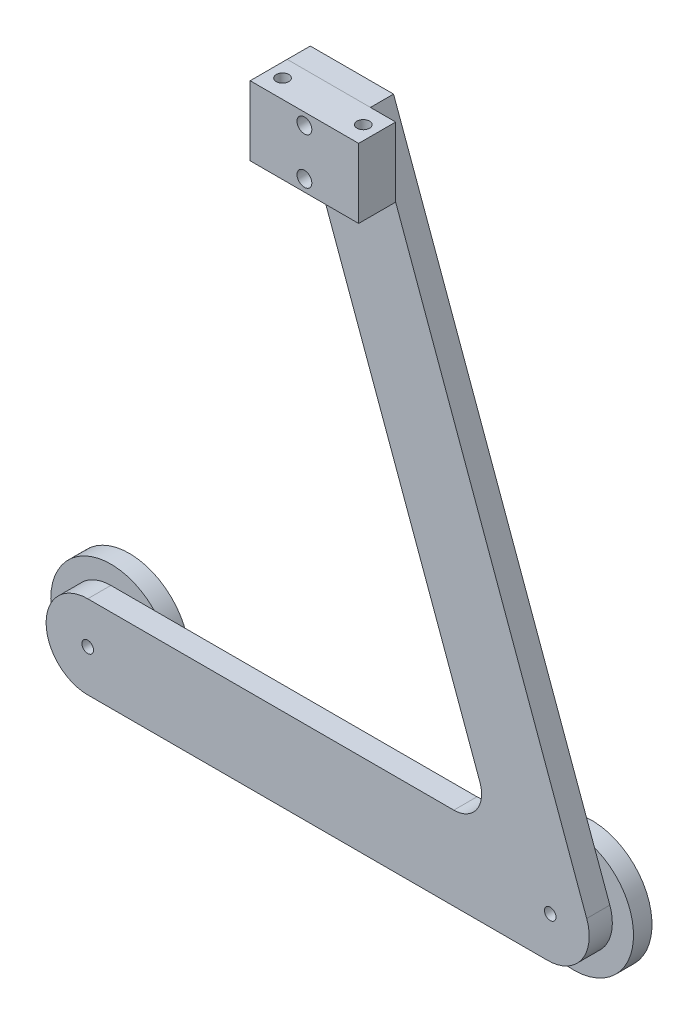
ISO-10303-21;
HEADER;
FILE_DESCRIPTION(('STEP AP214'),'2;1');
FILE_NAME('part.step','',(''),(''),'','','');
FILE_SCHEMA(('AUTOMOTIVE_DESIGN { 1 0 10303 214 1 1 1 1 }'));
ENDSEC;
DATA;
#1=APPLICATION_CONTEXT('core data for automotive mechanical design processes');
#2=APPLICATION_PROTOCOL_DEFINITION('international standard','automotive_design',2000,#1);
#3=PRODUCT_CONTEXT('',#1,'mechanical');
#4=PRODUCT('Part','Part','',(#3));
#5=PRODUCT_RELATED_PRODUCT_CATEGORY('part','',(#4));
#6=PRODUCT_DEFINITION_FORMATION('','',#4);
#7=PRODUCT_DEFINITION_CONTEXT('part definition',#1,'design');
#8=PRODUCT_DEFINITION('design','',#6,#7);
#9=PRODUCT_DEFINITION_SHAPE('','',#8);
#10=(LENGTH_UNIT() NAMED_UNIT(*) SI_UNIT(.MILLI.,.METRE.));
#11=(NAMED_UNIT(*) PLANE_ANGLE_UNIT() SI_UNIT($,.RADIAN.));
#12=(NAMED_UNIT(*) SI_UNIT($,.STERADIAN.) SOLID_ANGLE_UNIT());
#13=UNCERTAINTY_MEASURE_WITH_UNIT(LENGTH_MEASURE(1.E-05),#10,'distance_accuracy_value','');
#14=(GEOMETRIC_REPRESENTATION_CONTEXT(3) GLOBAL_UNCERTAINTY_ASSIGNED_CONTEXT((#13)) GLOBAL_UNIT_ASSIGNED_CONTEXT((#10,
#11,#12)) REPRESENTATION_CONTEXT('',''));
#15=CARTESIAN_POINT('',(0.,0.,0.));
#16=DIRECTION('',(0.,0.,1.));
#17=DIRECTION('',(1.,0.,0.));
#18=AXIS2_PLACEMENT_3D('',#15,#16,#17);
#19=CARTESIAN_POINT('',(-87.7242678916041,-8.99999999999999,-4.));
#20=DIRECTION('',(0.,0.,-1.));
#21=DIRECTION('',(-1.,0.,0.));
#22=AXIS2_PLACEMENT_3D('',#19,#20,#21);
#23=PLANE('',#22);
#24=CARTESIAN_POINT('',(-87.7242678916041,-8.99999999999999,-4.));
#25=DIRECTION('',(0.,0.,-1.));
#26=DIRECTION('',(-1.,0.,0.));
#27=AXIS2_PLACEMENT_3D('',#24,#25,#26);
#28=CIRCLE('',#27,13.);
#29=CARTESIAN_POINT('',(-100.724267891604,-8.99999999999999,-4.));
#30=VERTEX_POINT('',#29);
#31=EDGE_CURVE('E11',#30,#30,#28,.T.);
#32=ORIENTED_EDGE('',*,*,#31,.T.);
#33=EDGE_LOOP('',(#32));
#34=FACE_BOUND('',#33,.T.);
#35=CARTESIAN_POINT('',(-87.7242678916041,-8.99999999999999,-4.));
#36=DIRECTION('',(0.,0.,-1.));
#37=DIRECTION('',(-1.,0.,0.));
#38=AXIS2_PLACEMENT_3D('',#35,#36,#37);
#39=CIRCLE('',#38,3.00000000000001);
#40=CARTESIAN_POINT('',(-90.7242678916041,-8.99999999999999,-4.));
#41=VERTEX_POINT('',#40);
#42=EDGE_CURVE('E56',#41,#41,#39,.T.);
#43=ORIENTED_EDGE('',*,*,#42,.F.);
#44=EDGE_LOOP('',(#43));
#45=FACE_BOUND('',#44,.T.);
#46=ADVANCED_FACE('F45',(#34,#45),#23,.T.);
#47=CARTESIAN_POINT('',(-87.7242678916041,-8.99999999999999,0.));
#48=DIRECTION('',(0.,0.,-1.));
#49=DIRECTION('',(-1.,0.,0.));
#50=AXIS2_PLACEMENT_3D('',#47,#48,#49);
#51=PLANE('',#50);
#52=CARTESIAN_POINT('',(-87.7242678916041,-8.99999999999999,0.));
#53=DIRECTION('',(0.,0.,-1.));
#54=DIRECTION('',(-1.,0.,0.));
#55=AXIS2_PLACEMENT_3D('',#52,#53,#54);
#56=CIRCLE('',#55,13.);
#57=CARTESIAN_POINT('',(-100.724267891604,-8.99999999999999,0.));
#58=VERTEX_POINT('',#57);
#59=EDGE_CURVE('E49',#58,#58,#56,.T.);
#60=ORIENTED_EDGE('',*,*,#59,.F.);
#61=EDGE_LOOP('',(#60));
#62=FACE_BOUND('',#61,.T.);
#63=CARTESIAN_POINT('',(-87.7242678916041,-8.99999999999999,0.));
#64=DIRECTION('',(0.,0.,-1.));
#65=DIRECTION('',(-1.,0.,0.));
#66=AXIS2_PLACEMENT_3D('',#63,#64,#65);
#67=CIRCLE('',#66,3.00000000000001);
#68=CARTESIAN_POINT('',(-90.7242678916041,-8.99999999999999,0.));
#69=VERTEX_POINT('',#68);
#70=EDGE_CURVE('E58',#69,#69,#67,.T.);
#71=ORIENTED_EDGE('',*,*,#70,.T.);
#72=EDGE_LOOP('',(#71));
#73=FACE_BOUND('',#72,.T.);
#74=ADVANCED_FACE('F68',(#62,#73),#51,.F.);
#75=CARTESIAN_POINT('',(-87.7242678916041,-8.99999999999999,-4.));
#76=DIRECTION('',(0.,0.,1.));
#77=DIRECTION('',(1.,0.,0.));
#78=AXIS2_PLACEMENT_3D('',#75,#76,#77);
#79=CYLINDRICAL_SURFACE('',#78,13.);
#80=ORIENTED_EDGE('',*,*,#31,.F.);
#81=EDGE_LOOP('',(#80));
#82=FACE_BOUND('',#81,.T.);
#83=ORIENTED_EDGE('',*,*,#59,.T.);
#84=EDGE_LOOP('',(#83));
#85=FACE_BOUND('',#84,.T.);
#86=ADVANCED_FACE('F47',(#82,#85),#79,.T.);
#87=CARTESIAN_POINT('',(-87.7242678916041,-8.99999999999999,-4.));
#88=DIRECTION('',(0.,0.,1.));
#89=DIRECTION('',(1.,0.,0.));
#90=AXIS2_PLACEMENT_3D('',#87,#88,#89);
#91=CYLINDRICAL_SURFACE('',#90,3.00000000000001);
#92=ORIENTED_EDGE('',*,*,#42,.T.);
#93=EDGE_LOOP('',(#92));
#94=FACE_BOUND('',#93,.T.);
#95=ORIENTED_EDGE('',*,*,#70,.F.);
#96=EDGE_LOOP('',(#95));
#97=FACE_BOUND('',#96,.T.);
#98=ADVANCED_FACE('F64',(#94,#97),#91,.F.);
#99=CLOSED_SHELL('',(#46,#74,#86,#98));
#100=MANIFOLD_SOLID_BREP('B2',#99);
#101=CARTESIAN_POINT('',(12.2757321083959,-9.00000000000001,-4.));
#102=DIRECTION('',(0.,0.,-1.));
#103=DIRECTION('',(-1.,0.,0.));
#104=AXIS2_PLACEMENT_3D('',#101,#102,#103);
#105=PLANE('',#104);
#106=CARTESIAN_POINT('',(12.2757321083959,-9.00000000000001,-4.));
#107=DIRECTION('',(0.,0.,-1.));
#108=DIRECTION('',(-1.,0.,0.));
#109=AXIS2_PLACEMENT_3D('',#106,#107,#108);
#110=CIRCLE('',#109,13.);
#111=CARTESIAN_POINT('',(-0.724267891604135,-9.00000000000001,-4.));
#112=VERTEX_POINT('',#111);
#113=EDGE_CURVE('E44',#112,#112,#110,.T.);
#114=ORIENTED_EDGE('',*,*,#113,.T.);
#115=EDGE_LOOP('',(#114));
#116=FACE_BOUND('',#115,.T.);
#117=CARTESIAN_POINT('',(12.2757321083959,-9.00000000000001,-4.));
#118=DIRECTION('',(0.,0.,-1.));
#119=DIRECTION('',(-1.,0.,0.));
#120=AXIS2_PLACEMENT_3D('',#117,#118,#119);
#121=CIRCLE('',#120,3.);
#122=CARTESIAN_POINT('',(9.27573210839587,-9.00000000000001,-4.));
#123=VERTEX_POINT('',#122);
#124=EDGE_CURVE('E125',#123,#123,#121,.T.);
#125=ORIENTED_EDGE('',*,*,#124,.F.);
#126=EDGE_LOOP('',(#125));
#127=FACE_BOUND('',#126,.T.);
#128=ADVANCED_FACE('F114',(#116,#127),#105,.T.);
#129=CARTESIAN_POINT('',(12.2757321083959,-9.00000000000001,0.));
#130=DIRECTION('',(0.,0.,-1.));
#131=DIRECTION('',(-1.,0.,0.));
#132=AXIS2_PLACEMENT_3D('',#129,#130,#131);
#133=PLANE('',#132);
#134=CARTESIAN_POINT('',(12.2757321083959,-9.00000000000001,0.));
#135=DIRECTION('',(0.,0.,-1.));
#136=DIRECTION('',(-1.,0.,0.));
#137=AXIS2_PLACEMENT_3D('',#134,#135,#136);
#138=CIRCLE('',#137,13.);
#139=CARTESIAN_POINT('',(-0.724267891604135,-9.00000000000001,0.));
#140=VERTEX_POINT('',#139);
#141=EDGE_CURVE('E118',#140,#140,#138,.T.);
#142=ORIENTED_EDGE('',*,*,#141,.F.);
#143=EDGE_LOOP('',(#142));
#144=FACE_BOUND('',#143,.T.);
#145=CARTESIAN_POINT('',(12.2757321083959,-9.00000000000001,0.));
#146=DIRECTION('',(0.,0.,-1.));
#147=DIRECTION('',(-1.,0.,0.));
#148=AXIS2_PLACEMENT_3D('',#145,#146,#147);
#149=CIRCLE('',#148,3.);
#150=CARTESIAN_POINT('',(9.27573210839587,-9.00000000000001,0.));
#151=VERTEX_POINT('',#150);
#152=EDGE_CURVE('E127',#151,#151,#149,.T.);
#153=ORIENTED_EDGE('',*,*,#152,.T.);
#154=EDGE_LOOP('',(#153));
#155=FACE_BOUND('',#154,.T.);
#156=ADVANCED_FACE('F137',(#144,#155),#133,.F.);
#157=CARTESIAN_POINT('',(12.2757321083959,-9.00000000000001,-4.));
#158=DIRECTION('',(0.,0.,1.));
#159=DIRECTION('',(1.,0.,0.));
#160=AXIS2_PLACEMENT_3D('',#157,#158,#159);
#161=CYLINDRICAL_SURFACE('',#160,13.);
#162=ORIENTED_EDGE('',*,*,#113,.F.);
#163=EDGE_LOOP('',(#162));
#164=FACE_BOUND('',#163,.T.);
#165=ORIENTED_EDGE('',*,*,#141,.T.);
#166=EDGE_LOOP('',(#165));
#167=FACE_BOUND('',#166,.T.);
#168=ADVANCED_FACE('F116',(#164,#167),#161,.T.);
#169=CARTESIAN_POINT('',(12.2757321083959,-9.00000000000001,-4.));
#170=DIRECTION('',(0.,0.,1.));
#171=DIRECTION('',(1.,0.,0.));
#172=AXIS2_PLACEMENT_3D('',#169,#170,#171);
#173=CYLINDRICAL_SURFACE('',#172,3.);
#174=ORIENTED_EDGE('',*,*,#124,.T.);
#175=EDGE_LOOP('',(#174));
#176=FACE_BOUND('',#175,.T.);
#177=ORIENTED_EDGE('',*,*,#152,.F.);
#178=EDGE_LOOP('',(#177));
#179=FACE_BOUND('',#178,.T.);
#180=ADVANCED_FACE('F133',(#176,#179),#173,.F.);
#181=CLOSED_SHELL('',(#128,#156,#168,#180));
#182=MANIFOLD_SOLID_BREP('B6',#181);
#183=CARTESIAN_POINT('',(-87.7242678916041,-8.99999999999999,-5.));
#184=DIRECTION('',(0.,0.,-1.));
#185=DIRECTION('',(-1.,0.,0.));
#186=AXIS2_PLACEMENT_3D('',#183,#184,#185);
#187=PLANE('',#186);
#188=CARTESIAN_POINT('',(-87.7242678916041,-8.99999999999999,-5.));
#189=DIRECTION('',(0.,0.,-1.));
#190=DIRECTION('',(-1.,0.,0.));
#191=AXIS2_PLACEMENT_3D('',#188,#189,#190);
#192=CIRCLE('',#191,3.00000000000001);
#193=CARTESIAN_POINT('',(-90.7242678916041,-8.99999999999999,-5.));
#194=VERTEX_POINT('',#193);
#195=EDGE_CURVE('E113',#194,#194,#192,.T.);
#196=ORIENTED_EDGE('',*,*,#195,.T.);
#197=EDGE_LOOP('',(#196));
#198=FACE_BOUND('',#197,.T.);
#199=CARTESIAN_POINT('',(-87.7242678916041,-8.99999999999999,-5.));
#200=DIRECTION('',(0.,0.,-1.));
#201=DIRECTION('',(-1.,0.,0.));
#202=AXIS2_PLACEMENT_3D('',#199,#200,#201);
#203=CIRCLE('',#202,1.25);
#204=CARTESIAN_POINT('',(-88.9742678916041,-8.99999999999999,-5.));
#205=VERTEX_POINT('',#204);
#206=EDGE_CURVE('E194',#205,#205,#203,.T.);
#207=ORIENTED_EDGE('',*,*,#206,.F.);
#208=EDGE_LOOP('',(#207));
#209=FACE_BOUND('',#208,.T.);
#210=ADVANCED_FACE('F183',(#198,#209),#187,.T.);
#211=CARTESIAN_POINT('',(-87.7242678916041,-8.99999999999999,0.));
#212=DIRECTION('',(0.,0.,-1.));
#213=DIRECTION('',(-1.,0.,0.));
#214=AXIS2_PLACEMENT_3D('',#211,#212,#213);
#215=PLANE('',#214);
#216=CARTESIAN_POINT('',(-87.7242678916041,-8.99999999999999,0.));
#217=DIRECTION('',(0.,0.,-1.));
#218=DIRECTION('',(-1.,0.,0.));
#219=AXIS2_PLACEMENT_3D('',#216,#217,#218);
#220=CIRCLE('',#219,3.00000000000001);
#221=CARTESIAN_POINT('',(-90.7242678916041,-8.99999999999999,0.));
#222=VERTEX_POINT('',#221);
#223=EDGE_CURVE('E187',#222,#222,#220,.T.);
#224=ORIENTED_EDGE('',*,*,#223,.F.);
#225=EDGE_LOOP('',(#224));
#226=FACE_BOUND('',#225,.T.);
#227=CARTESIAN_POINT('',(-87.7242678916041,-8.99999999999999,0.));
#228=DIRECTION('',(0.,0.,-1.));
#229=DIRECTION('',(-1.,0.,0.));
#230=AXIS2_PLACEMENT_3D('',#227,#228,#229);
#231=CIRCLE('',#230,1.25);
#232=CARTESIAN_POINT('',(-88.9742678916041,-8.99999999999999,0.));
#233=VERTEX_POINT('',#232);
#234=EDGE_CURVE('E196',#233,#233,#231,.T.);
#235=ORIENTED_EDGE('',*,*,#234,.T.);
#236=EDGE_LOOP('',(#235));
#237=FACE_BOUND('',#236,.T.);
#238=ADVANCED_FACE('F206',(#226,#237),#215,.F.);
#239=CARTESIAN_POINT('',(-87.7242678916041,-8.99999999999999,-5.));
#240=DIRECTION('',(0.,0.,1.));
#241=DIRECTION('',(1.,0.,0.));
#242=AXIS2_PLACEMENT_3D('',#239,#240,#241);
#243=CYLINDRICAL_SURFACE('',#242,3.00000000000001);
#244=ORIENTED_EDGE('',*,*,#195,.F.);
#245=EDGE_LOOP('',(#244));
#246=FACE_BOUND('',#245,.T.);
#247=ORIENTED_EDGE('',*,*,#223,.T.);
#248=EDGE_LOOP('',(#247));
#249=FACE_BOUND('',#248,.T.);
#250=ADVANCED_FACE('F185',(#246,#249),#243,.T.);
#251=CARTESIAN_POINT('',(-87.7242678916041,-8.99999999999999,-5.));
#252=DIRECTION('',(0.,0.,1.));
#253=DIRECTION('',(1.,0.,0.));
#254=AXIS2_PLACEMENT_3D('',#251,#252,#253);
#255=CYLINDRICAL_SURFACE('',#254,1.25);
#256=ORIENTED_EDGE('',*,*,#206,.T.);
#257=EDGE_LOOP('',(#256));
#258=FACE_BOUND('',#257,.T.);
#259=ORIENTED_EDGE('',*,*,#234,.F.);
#260=EDGE_LOOP('',(#259));
#261=FACE_BOUND('',#260,.T.);
#262=ADVANCED_FACE('F202',(#258,#261),#255,.F.);
#263=CLOSED_SHELL('',(#210,#238,#250,#262));
#264=MANIFOLD_SOLID_BREP('B39',#263);
#265=CARTESIAN_POINT('',(12.2757321083959,-9.00000000000001,-5.));
#266=DIRECTION('',(0.,0.,-1.));
#267=DIRECTION('',(-1.,0.,0.));
#268=AXIS2_PLACEMENT_3D('',#265,#266,#267);
#269=PLANE('',#268);
#270=CARTESIAN_POINT('',(12.2757321083959,-9.00000000000001,-5.));
#271=DIRECTION('',(0.,0.,-1.));
#272=DIRECTION('',(-1.,0.,0.));
#273=AXIS2_PLACEMENT_3D('',#270,#271,#272);
#274=CIRCLE('',#273,3.);
#275=CARTESIAN_POINT('',(9.27573210839587,-9.00000000000001,-5.));
#276=VERTEX_POINT('',#275);
#277=EDGE_CURVE('E182',#276,#276,#274,.T.);
#278=ORIENTED_EDGE('',*,*,#277,.T.);
#279=EDGE_LOOP('',(#278));
#280=FACE_BOUND('',#279,.T.);
#281=CARTESIAN_POINT('',(12.2757321083959,-9.00000000000001,-5.));
#282=DIRECTION('',(0.,0.,-1.));
#283=DIRECTION('',(-1.,0.,0.));
#284=AXIS2_PLACEMENT_3D('',#281,#282,#283);
#285=CIRCLE('',#284,1.25);
#286=CARTESIAN_POINT('',(11.0257321083959,-9.00000000000001,-5.));
#287=VERTEX_POINT('',#286);
#288=EDGE_CURVE('E265',#287,#287,#285,.T.);
#289=ORIENTED_EDGE('',*,*,#288,.F.);
#290=EDGE_LOOP('',(#289));
#291=FACE_BOUND('',#290,.T.);
#292=ADVANCED_FACE('F254',(#280,#291),#269,.T.);
#293=CARTESIAN_POINT('',(12.2757321083959,-9.00000000000001,0.));
#294=DIRECTION('',(0.,0.,-1.));
#295=DIRECTION('',(-1.,0.,0.));
#296=AXIS2_PLACEMENT_3D('',#293,#294,#295);
#297=PLANE('',#296);
#298=CARTESIAN_POINT('',(12.2757321083959,-9.00000000000001,0.));
#299=DIRECTION('',(0.,0.,-1.));
#300=DIRECTION('',(-1.,0.,0.));
#301=AXIS2_PLACEMENT_3D('',#298,#299,#300);
#302=CIRCLE('',#301,3.);
#303=CARTESIAN_POINT('',(9.27573210839587,-9.00000000000001,0.));
#304=VERTEX_POINT('',#303);
#305=EDGE_CURVE('E258',#304,#304,#302,.T.);
#306=ORIENTED_EDGE('',*,*,#305,.F.);
#307=EDGE_LOOP('',(#306));
#308=FACE_BOUND('',#307,.T.);
#309=CARTESIAN_POINT('',(12.2757321083959,-9.00000000000001,0.));
#310=DIRECTION('',(0.,0.,-1.));
#311=DIRECTION('',(-1.,0.,0.));
#312=AXIS2_PLACEMENT_3D('',#309,#310,#311);
#313=CIRCLE('',#312,1.25);
#314=CARTESIAN_POINT('',(11.0257321083959,-9.00000000000001,0.));
#315=VERTEX_POINT('',#314);
#316=EDGE_CURVE('E267',#315,#315,#313,.T.);
#317=ORIENTED_EDGE('',*,*,#316,.T.);
#318=EDGE_LOOP('',(#317));
#319=FACE_BOUND('',#318,.T.);
#320=ADVANCED_FACE('F277',(#308,#319),#297,.F.);
#321=CARTESIAN_POINT('',(12.2757321083959,-9.00000000000001,-5.));
#322=DIRECTION('',(0.,0.,1.));
#323=DIRECTION('',(1.,0.,0.));
#324=AXIS2_PLACEMENT_3D('',#321,#322,#323);
#325=CYLINDRICAL_SURFACE('',#324,3.);
#326=ORIENTED_EDGE('',*,*,#277,.F.);
#327=EDGE_LOOP('',(#326));
#328=FACE_BOUND('',#327,.T.);
#329=ORIENTED_EDGE('',*,*,#305,.T.);
#330=EDGE_LOOP('',(#329));
#331=FACE_BOUND('',#330,.T.);
#332=ADVANCED_FACE('F256',(#328,#331),#325,.T.);
#333=CARTESIAN_POINT('',(12.2757321083959,-9.00000000000001,-5.));
#334=DIRECTION('',(0.,0.,1.));
#335=DIRECTION('',(1.,0.,0.));
#336=AXIS2_PLACEMENT_3D('',#333,#334,#335);
#337=CYLINDRICAL_SURFACE('',#336,1.25);
#338=ORIENTED_EDGE('',*,*,#288,.T.);
#339=EDGE_LOOP('',(#338));
#340=FACE_BOUND('',#339,.T.);
#341=ORIENTED_EDGE('',*,*,#316,.F.);
#342=EDGE_LOOP('',(#341));
#343=FACE_BOUND('',#342,.T.);
#344=ADVANCED_FACE('F273',(#340,#343),#337,.F.);
#345=CLOSED_SHELL('',(#292,#320,#332,#344));
#346=MANIFOLD_SOLID_BREP('B108',#345);
#347=CARTESIAN_POINT('',(-44.6070879571983,122.556966910027,13.));
#348=DIRECTION('',(1.,0.,0.));
#349=DIRECTION('',(0.,0.,-1.));
#350=AXIS2_PLACEMENT_3D('',#347,#348,#349);
#351=PLANE('',#350);
#352=DIRECTION('',(0.,-1.,0.));
#353=VECTOR('',#352,1.);
#354=CARTESIAN_POINT('',(-44.6070879571983,122.556966910027,5.));
#355=LINE('',#354,#353);
#356=CARTESIAN_POINT('',(-44.6070879571983,122.556966910027,5.));
#357=VERTEX_POINT('',#356);
#358=CARTESIAN_POINT('',(-44.6070879571983,107.556966910027,5.));
#359=VERTEX_POINT('',#358);
#360=EDGE_CURVE('E391',#357,#359,#355,.T.);
#361=ORIENTED_EDGE('',*,*,#360,.T.);
#362=DIRECTION('',(0.,0.,-1.));
#363=VECTOR('',#362,1.);
#364=CARTESIAN_POINT('',(-44.6070879571983,107.556966910027,13.));
#365=LINE('',#364,#363);
#366=CARTESIAN_POINT('',(-44.6070879571983,107.556966910027,13.));
#367=VERTEX_POINT('',#366);
#368=EDGE_CURVE('E252',#367,#359,#365,.T.);
#369=ORIENTED_EDGE('',*,*,#368,.F.);
#370=DIRECTION('',(0.,-1.,0.));
#371=VECTOR('',#370,1.);
#372=CARTESIAN_POINT('',(-44.6070879571983,122.556966910027,13.));
#373=LINE('',#372,#371);
#374=CARTESIAN_POINT('',(-44.6070879571983,122.556966910027,13.));
#375=VERTEX_POINT('',#374);
#376=EDGE_CURVE('E378',#375,#367,#373,.T.);
#377=ORIENTED_EDGE('',*,*,#376,.F.);
#378=DIRECTION('',(0.,0.,-1.));
#379=VECTOR('',#378,1.);
#380=CARTESIAN_POINT('',(-44.6070879571983,122.556966910027,13.));
#381=LINE('',#380,#379);
#382=EDGE_CURVE('E387',#375,#357,#381,.T.);
#383=ORIENTED_EDGE('',*,*,#382,.T.);
#384=EDGE_LOOP('',(#361,#369,#377,#383));
#385=FACE_BOUND('',#384,.T.);
#386=ADVANCED_FACE('F325',(#385),#351,.F.);
#387=CARTESIAN_POINT('',(-44.6070879571983,107.556966910027,13.));
#388=DIRECTION('',(0.,1.,0.));
#389=DIRECTION('',(0.,0.,1.));
#390=AXIS2_PLACEMENT_3D('',#387,#388,#389);
#391=PLANE('',#390);
#392=CARTESIAN_POINT('',(-24.1475344432052,107.556966910027,9.));
#393=DIRECTION('',(0.,-1.,0.));
#394=DIRECTION('',(0.,0.,-1.));
#395=AXIS2_PLACEMENT_3D('',#392,#393,#394);
#396=CIRCLE('',#395,1.35);
#397=CARTESIAN_POINT('',(-24.1475344432052,107.556966910027,7.65));
#398=VERTEX_POINT('',#397);
#399=EDGE_CURVE('E419',#398,#398,#396,.T.);
#400=ORIENTED_EDGE('',*,*,#399,.F.);
#401=EDGE_LOOP('',(#400));
#402=FACE_BOUND('',#401,.T.);
#403=CARTESIAN_POINT('',(-41.6070879571983,107.556966910027,9.));
#404=DIRECTION('',(0.,-1.,0.));
#405=DIRECTION('',(0.,0.,1.));
#406=AXIS2_PLACEMENT_3D('',#403,#404,#405);
#407=CIRCLE('',#406,1.35);
#408=CARTESIAN_POINT('',(-41.6070879571983,107.556966910027,10.35));
#409=VERTEX_POINT('',#408);
#410=EDGE_CURVE('E413',#409,#409,#407,.T.);
#411=ORIENTED_EDGE('',*,*,#410,.F.);
#412=EDGE_LOOP('',(#411));
#413=FACE_BOUND('',#412,.T.);
#414=DIRECTION('',(1.,0.,0.));
#415=VECTOR('',#414,1.);
#416=CARTESIAN_POINT('',(-44.6070879571983,107.556966910027,5.));
#417=LINE('',#416,#415);
#418=CARTESIAN_POINT('',(-21.1475344432052,107.556966910027,5.));
#419=VERTEX_POINT('',#418);
#420=EDGE_CURVE('E382',#359,#419,#417,.T.);
#421=ORIENTED_EDGE('',*,*,#420,.T.);
#422=DIRECTION('',(0.,0.,-1.));
#423=VECTOR('',#422,1.);
#424=CARTESIAN_POINT('',(-21.1475344432052,107.556966910027,13.));
#425=LINE('',#424,#423);
#426=CARTESIAN_POINT('',(-21.1475344432052,107.556966910027,13.));
#427=VERTEX_POINT('',#426);
#428=EDGE_CURVE('E334',#427,#419,#425,.T.);
#429=ORIENTED_EDGE('',*,*,#428,.F.);
#430=DIRECTION('',(1.,0.,0.));
#431=VECTOR('',#430,1.);
#432=CARTESIAN_POINT('',(-44.6070879571983,107.556966910027,13.));
#433=LINE('',#432,#431);
#434=EDGE_CURVE('E373',#367,#427,#433,.T.);
#435=ORIENTED_EDGE('',*,*,#434,.F.);
#436=ORIENTED_EDGE('',*,*,#368,.T.);
#437=EDGE_LOOP('',(#421,#429,#435,#436));
#438=FACE_BOUND('',#437,.T.);
#439=ADVANCED_FACE('F381',(#402,#413,#438),#391,.F.);
#440=CARTESIAN_POINT('',(-21.1475344432052,122.556966910027,13.));
#441=DIRECTION('',(-1.,0.,0.));
#442=DIRECTION('',(0.,0.,1.));
#443=AXIS2_PLACEMENT_3D('',#440,#441,#442);
#444=PLANE('',#443);
#445=DIRECTION('',(0.,1.,0.));
#446=VECTOR('',#445,1.);
#447=CARTESIAN_POINT('',(-21.1475344432052,122.556966910027,5.));
#448=LINE('',#447,#446);
#449=CARTESIAN_POINT('',(-21.1475344432052,122.556966910027,5.));
#450=VERTEX_POINT('',#449);
#451=EDGE_CURVE('E360',#419,#450,#448,.T.);
#452=ORIENTED_EDGE('',*,*,#451,.T.);
#453=DIRECTION('',(0.,0.,-1.));
#454=VECTOR('',#453,1.);
#455=CARTESIAN_POINT('',(-21.1475344432052,122.556966910027,13.));
#456=LINE('',#455,#454);
#457=CARTESIAN_POINT('',(-21.1475344432052,122.556966910027,13.));
#458=VERTEX_POINT('',#457);
#459=EDGE_CURVE('E383',#458,#450,#456,.T.);
#460=ORIENTED_EDGE('',*,*,#459,.F.);
#461=DIRECTION('',(0.,1.,0.));
#462=VECTOR('',#461,1.);
#463=CARTESIAN_POINT('',(-21.1475344432052,122.556966910027,13.));
#464=LINE('',#463,#462);
#465=EDGE_CURVE('E376',#427,#458,#464,.T.);
#466=ORIENTED_EDGE('',*,*,#465,.F.);
#467=ORIENTED_EDGE('',*,*,#428,.T.);
#468=EDGE_LOOP('',(#452,#460,#466,#467));
#469=FACE_BOUND('',#468,.T.);
#470=ADVANCED_FACE('F385',(#469),#444,.F.);
#471=CARTESIAN_POINT('',(-44.6070879571983,122.556966910027,13.));
#472=DIRECTION('',(0.,-1.,0.));
#473=DIRECTION('',(0.,0.,-1.));
#474=AXIS2_PLACEMENT_3D('',#471,#472,#473);
#475=PLANE('',#474);
#476=CARTESIAN_POINT('',(-24.1475344432052,122.556966910027,9.));
#477=DIRECTION('',(0.,-1.,0.));
#478=DIRECTION('',(0.,0.,-1.));
#479=AXIS2_PLACEMENT_3D('',#476,#477,#478);
#480=CIRCLE('',#479,1.35);
#481=CARTESIAN_POINT('',(-24.1475344432052,122.556966910027,7.65));
#482=VERTEX_POINT('',#481);
#483=EDGE_CURVE('E410',#482,#482,#480,.T.);
#484=ORIENTED_EDGE('',*,*,#483,.T.);
#485=EDGE_LOOP('',(#484));
#486=FACE_BOUND('',#485,.T.);
#487=CARTESIAN_POINT('',(-41.6070879571983,122.556966910027,9.));
#488=DIRECTION('',(0.,-1.,0.));
#489=DIRECTION('',(0.,0.,1.));
#490=AXIS2_PLACEMENT_3D('',#487,#488,#489);
#491=CIRCLE('',#490,1.35);
#492=CARTESIAN_POINT('',(-41.6070879571983,122.556966910027,10.35));
#493=VERTEX_POINT('',#492);
#494=EDGE_CURVE('E416',#493,#493,#491,.T.);
#495=ORIENTED_EDGE('',*,*,#494,.T.);
#496=EDGE_LOOP('',(#495));
#497=FACE_BOUND('',#496,.T.);
#498=DIRECTION('',(-1.,0.,0.));
#499=VECTOR('',#498,1.);
#500=CARTESIAN_POINT('',(-44.6070879571983,122.556966910027,5.));
#501=LINE('',#500,#499);
#502=EDGE_CURVE('E366',#450,#357,#501,.T.);
#503=ORIENTED_EDGE('',*,*,#502,.T.);
#504=ORIENTED_EDGE('',*,*,#382,.F.);
#505=DIRECTION('',(-1.,0.,0.));
#506=VECTOR('',#505,1.);
#507=CARTESIAN_POINT('',(-44.6070879571983,122.556966910027,13.));
#508=LINE('',#507,#506);
#509=EDGE_CURVE('E343',#458,#375,#508,.T.);
#510=ORIENTED_EDGE('',*,*,#509,.F.);
#511=ORIENTED_EDGE('',*,*,#459,.T.);
#512=EDGE_LOOP('',(#503,#504,#510,#511));
#513=FACE_BOUND('',#512,.T.);
#514=ADVANCED_FACE('F425',(#486,#497,#513),#475,.F.);
#515=CARTESIAN_POINT('',(0.,0.,13.));
#516=DIRECTION('',(0.,0.,1.));
#517=DIRECTION('',(1.,0.,0.));
#518=AXIS2_PLACEMENT_3D('',#515,#516,#517);
#519=PLANE('',#518);
#520=CARTESIAN_POINT('',(-32.8773112002017,120.056966910027,13.));
#521=DIRECTION('',(0.,0.,1.));
#522=DIRECTION('',(1.,0.,0.));
#523=AXIS2_PLACEMENT_3D('',#520,#521,#522);
#524=CIRCLE('',#523,1.60000000000001);
#525=CARTESIAN_POINT('',(-31.2773112002017,120.056966910027,13.));
#526=VERTEX_POINT('',#525);
#527=EDGE_CURVE('E400',#526,#526,#524,.T.);
#528=ORIENTED_EDGE('',*,*,#527,.F.);
#529=EDGE_LOOP('',(#528));
#530=FACE_BOUND('',#529,.T.);
#531=CARTESIAN_POINT('',(-32.8773112002017,110.056966910027,13.));
#532=DIRECTION('',(0.,0.,1.));
#533=DIRECTION('',(-1.,0.,0.));
#534=AXIS2_PLACEMENT_3D('',#531,#532,#533);
#535=CIRCLE('',#534,1.60000000000001);
#536=CARTESIAN_POINT('',(-34.4773112002017,110.056966910027,13.));
#537=VERTEX_POINT('',#536);
#538=EDGE_CURVE('E405',#537,#537,#535,.T.);
#539=ORIENTED_EDGE('',*,*,#538,.F.);
#540=EDGE_LOOP('',(#539));
#541=FACE_BOUND('',#540,.T.);
#542=ORIENTED_EDGE('',*,*,#376,.T.);
#543=ORIENTED_EDGE('',*,*,#434,.T.);
#544=ORIENTED_EDGE('',*,*,#465,.T.);
#545=ORIENTED_EDGE('',*,*,#509,.T.);
#546=EDGE_LOOP('',(#542,#543,#544,#545));
#547=FACE_BOUND('',#546,.T.);
#548=ADVANCED_FACE('F374',(#530,#541,#547),#519,.T.);
#549=CARTESIAN_POINT('',(0.,0.,5.));
#550=DIRECTION('',(0.,0.,1.));
#551=DIRECTION('',(1.,0.,0.));
#552=AXIS2_PLACEMENT_3D('',#549,#550,#551);
#553=PLANE('',#552);
#554=CARTESIAN_POINT('',(-32.8773112002017,120.056966910027,5.));
#555=DIRECTION('',(0.,0.,1.));
#556=DIRECTION('',(1.,0.,0.));
#557=AXIS2_PLACEMENT_3D('',#554,#555,#556);
#558=CIRCLE('',#557,1.60000000000001);
#559=CARTESIAN_POINT('',(-31.2773112002017,120.056966910027,5.));
#560=VERTEX_POINT('',#559);
#561=EDGE_CURVE('E328',#560,#560,#558,.T.);
#562=ORIENTED_EDGE('',*,*,#561,.T.);
#563=EDGE_LOOP('',(#562));
#564=FACE_BOUND('',#563,.T.);
#565=CARTESIAN_POINT('',(-32.8773112002017,110.056966910027,5.));
#566=DIRECTION('',(0.,0.,1.));
#567=DIRECTION('',(1.,0.,0.));
#568=AXIS2_PLACEMENT_3D('',#565,#566,#567);
#569=CIRCLE('',#568,1.60000000000001);
#570=CARTESIAN_POINT('',(-31.2773112002017,110.056966910027,5.));
#571=VERTEX_POINT('',#570);
#572=EDGE_CURVE('E398',#571,#571,#569,.T.);
#573=ORIENTED_EDGE('',*,*,#572,.T.);
#574=EDGE_LOOP('',(#573));
#575=FACE_BOUND('',#574,.T.);
#576=ORIENTED_EDGE('',*,*,#360,.F.);
#577=ORIENTED_EDGE('',*,*,#502,.F.);
#578=ORIENTED_EDGE('',*,*,#451,.F.);
#579=ORIENTED_EDGE('',*,*,#420,.F.);
#580=EDGE_LOOP('',(#576,#577,#578,#579));
#581=FACE_BOUND('',#580,.T.);
#582=ADVANCED_FACE('F455',(#564,#575,#581),#553,.F.);
#583=CARTESIAN_POINT('',(-32.8773112002017,110.056966910027,0.));
#584=DIRECTION('',(0.,0.,1.));
#585=DIRECTION('',(1.,0.,0.));
#586=AXIS2_PLACEMENT_3D('',#583,#584,#585);
#587=CYLINDRICAL_SURFACE('',#586,1.60000000000001);
#588=ORIENTED_EDGE('',*,*,#538,.T.);
#589=EDGE_LOOP('',(#588));
#590=FACE_BOUND('',#589,.T.);
#591=ORIENTED_EDGE('',*,*,#572,.F.);
#592=EDGE_LOOP('',(#591));
#593=FACE_BOUND('',#592,.T.);
#594=ADVANCED_FACE('F446',(#590,#593),#587,.F.);
#595=CARTESIAN_POINT('',(-32.8773112002017,120.056966910027,0.));
#596=DIRECTION('',(0.,0.,1.));
#597=DIRECTION('',(1.,0.,0.));
#598=AXIS2_PLACEMENT_3D('',#595,#596,#597);
#599=CYLINDRICAL_SURFACE('',#598,1.60000000000001);
#600=ORIENTED_EDGE('',*,*,#527,.T.);
#601=EDGE_LOOP('',(#600));
#602=FACE_BOUND('',#601,.T.);
#603=ORIENTED_EDGE('',*,*,#561,.F.);
#604=EDGE_LOOP('',(#603));
#605=FACE_BOUND('',#604,.T.);
#606=ADVANCED_FACE('F440',(#602,#605),#599,.F.);
#607=CARTESIAN_POINT('',(-41.6070879571983,122.556966910027,9.));
#608=DIRECTION('',(0.,-1.,0.));
#609=DIRECTION('',(0.,0.,-1.));
#610=AXIS2_PLACEMENT_3D('',#607,#608,#609);
#611=CYLINDRICAL_SURFACE('',#610,1.35);
#612=ORIENTED_EDGE('',*,*,#494,.F.);
#613=EDGE_LOOP('',(#612));
#614=FACE_BOUND('',#613,.T.);
#615=ORIENTED_EDGE('',*,*,#410,.T.);
#616=EDGE_LOOP('',(#615));
#617=FACE_BOUND('',#616,.T.);
#618=ADVANCED_FACE('F431',(#614,#617),#611,.F.);
#619=CARTESIAN_POINT('',(-24.1475344432052,122.556966910027,9.));
#620=DIRECTION('',(0.,-1.,0.));
#621=DIRECTION('',(0.,0.,-1.));
#622=AXIS2_PLACEMENT_3D('',#619,#620,#621);
#623=CYLINDRICAL_SURFACE('',#622,1.35);
#624=ORIENTED_EDGE('',*,*,#483,.F.);
#625=EDGE_LOOP('',(#624));
#626=FACE_BOUND('',#625,.T.);
#627=ORIENTED_EDGE('',*,*,#399,.T.);
#628=EDGE_LOOP('',(#627));
#629=FACE_BOUND('',#628,.T.);
#630=ADVANCED_FACE('F428',(#626,#629),#623,.F.);
#631=CLOSED_SHELL('',(#386,#439,#470,#514,#548,#582,#594,#606,#618,#630));
#632=MANIFOLD_SOLID_BREP('B177',#631);
#633=CARTESIAN_POINT('',(-8.56888804045274,6.00000000000001,5.));
#634=DIRECTION('',(0.,0.,-1.));
#635=DIRECTION('',(-1.,0.,0.));
#636=AXIS2_PLACEMENT_3D('',#633,#634,#635);
#637=PLANE('',#636);
#638=CARTESIAN_POINT('',(-32.8773112002017,120.056966910027,5.));
#639=DIRECTION('',(0.,0.,-1.));
#640=DIRECTION('',(-1.,0.,0.));
#641=AXIS2_PLACEMENT_3D('',#638,#639,#640);
#642=CIRCLE('',#641,1.60000000000001);
#643=CARTESIAN_POINT('',(-34.4773112002017,120.056966910027,5.));
#644=VERTEX_POINT('',#643);
#645=EDGE_CURVE('E687',#644,#644,#642,.T.);
#646=ORIENTED_EDGE('',*,*,#645,.T.);
#647=EDGE_LOOP('',(#646));
#648=FACE_BOUND('',#647,.T.);
#649=CARTESIAN_POINT('',(-32.8773112002017,110.056966910027,5.));
#650=DIRECTION('',(0.,0.,-1.));
#651=DIRECTION('',(-1.,0.,0.));
#652=AXIS2_PLACEMENT_3D('',#649,#650,#651);
#653=CIRCLE('',#652,1.60000000000001);
#654=CARTESIAN_POINT('',(-34.4773112002017,110.056966910027,5.));
#655=VERTEX_POINT('',#654);
#656=EDGE_CURVE('E692',#655,#655,#653,.T.);
#657=ORIENTED_EDGE('',*,*,#656,.T.);
#658=EDGE_LOOP('',(#657));
#659=FACE_BOUND('',#658,.T.);
#660=DIRECTION('',(-1.,0.,0.));
#661=VECTOR('',#660,1.);
#662=CARTESIAN_POINT('',(-26.6070879571983,122.556966910027,5.));
#663=LINE('',#662,#661);
#664=CARTESIAN_POINT('',(-26.6070879571983,122.556966910027,5.));
#665=VERTEX_POINT('',#664);
#666=CARTESIAN_POINT('',(-44.6070879571983,122.556966910027,5.));
#667=VERTEX_POINT('',#666);
#668=EDGE_CURVE('E645',#665,#667,#663,.T.);
#669=ORIENTED_EDGE('',*,*,#668,.T.);
#670=DIRECTION('',(0.342020143325672,-0.939692620785907,0.));
#671=VECTOR('',#670,1.);
#672=CARTESIAN_POINT('',(-44.6070879571983,122.556966910027,5.));
#673=LINE('',#672,#671);
#674=CARTESIAN_POINT('',(-2.93073231573729,8.05212085995404,5.));
#675=VERTEX_POINT('',#674);
#676=EDGE_CURVE('E592',#667,#675,#673,.T.);
#677=ORIENTED_EDGE('',*,*,#676,.T.);
#678=CARTESIAN_POINT('',(-8.56888804045274,6.00000000000001,5.));
#679=DIRECTION('',(0.,0.,-1.));
#680=DIRECTION('',(-1.,0.,0.));
#681=AXIS2_PLACEMENT_3D('',#678,#679,#680);
#682=CIRCLE('',#681,6.00000000000001);
#683=CARTESIAN_POINT('',(-8.56888804045273,0.,5.));
#684=VERTEX_POINT('',#683);
#685=EDGE_CURVE('E660',#675,#684,#682,.T.);
#686=ORIENTED_EDGE('',*,*,#685,.T.);
#687=DIRECTION('',(-1.,0.,0.));
#688=VECTOR('',#687,1.);
#689=CARTESIAN_POINT('',(-8.56888804045274,0.,5.));
#690=LINE('',#689,#688);
#691=CARTESIAN_POINT('',(-87.7242678916041,0.,5.));
#692=VERTEX_POINT('',#691);
#693=EDGE_CURVE('E672',#684,#692,#690,.T.);
#694=ORIENTED_EDGE('',*,*,#693,.T.);
#695=CARTESIAN_POINT('',(-87.7242678916041,-8.99999999999999,5.));
#696=DIRECTION('',(0.,0.,1.));
#697=DIRECTION('',(1.,0.,0.));
#698=AXIS2_PLACEMENT_3D('',#695,#696,#697);
#699=CIRCLE('',#698,9.);
#700=CARTESIAN_POINT('',(-87.7242678916041,-18.,5.));
#701=VERTEX_POINT('',#700);
#702=EDGE_CURVE('E611',#692,#701,#699,.T.);
#703=ORIENTED_EDGE('',*,*,#702,.T.);
#704=DIRECTION('',(1.,0.,0.));
#705=VECTOR('',#704,1.);
#706=CARTESIAN_POINT('',(-87.7242678916041,-18.,5.));
#707=LINE('',#706,#705);
#708=CARTESIAN_POINT('',(11.6981321561127,-18.,5.));
#709=VERTEX_POINT('',#708);
#710=EDGE_CURVE('E605',#701,#709,#707,.T.);
#711=ORIENTED_EDGE('',*,*,#710,.T.);
#712=CARTESIAN_POINT('',(11.6981321561127,-9.00000000000001,5.));
#713=DIRECTION('',(0.,0.,1.));
#714=DIRECTION('',(1.,0.,0.));
#715=AXIS2_PLACEMENT_3D('',#712,#713,#714);
#716=CIRCLE('',#715,8.99999999999999);
#717=CARTESIAN_POINT('',(20.1553657431858,-5.92181871006896,5.));
#718=VERTEX_POINT('',#717);
#719=EDGE_CURVE('E609',#709,#718,#716,.T.);
#720=ORIENTED_EDGE('',*,*,#719,.T.);
#721=DIRECTION('',(-0.342020143325672,0.939692620785907,0.));
#722=VECTOR('',#721,1.);
#723=CARTESIAN_POINT('',(20.1553657431858,-5.92181871006897,5.));
#724=LINE('',#723,#722);
#725=EDGE_CURVE('E549',#718,#665,#724,.T.);
#726=ORIENTED_EDGE('',*,*,#725,.T.);
#727=EDGE_LOOP('',(#669,#677,#686,#694,#703,#711,#720,#726));
#728=FACE_BOUND('',#727,.T.);
#729=CARTESIAN_POINT('',(-87.7242678916041,-8.99999999999999,5.));
#730=DIRECTION('',(0.,0.,1.));
#731=DIRECTION('',(1.,0.,0.));
#732=AXIS2_PLACEMENT_3D('',#729,#730,#731);
#733=CIRCLE('',#732,1.25);
#734=CARTESIAN_POINT('',(-86.4742678916041,-8.99999999999999,5.));
#735=VERTEX_POINT('',#734);
#736=EDGE_CURVE('E633',#735,#735,#733,.T.);
#737=ORIENTED_EDGE('',*,*,#736,.F.);
#738=EDGE_LOOP('',(#737));
#739=FACE_BOUND('',#738,.T.);
#740=CARTESIAN_POINT('',(12.2757321083959,-9.00000000000001,5.));
#741=DIRECTION('',(0.,0.,1.));
#742=DIRECTION('',(1.,0.,0.));
#743=AXIS2_PLACEMENT_3D('',#740,#741,#742);
#744=CIRCLE('',#743,1.25);
#745=CARTESIAN_POINT('',(13.5257321083959,-9.00000000000001,5.));
#746=VERTEX_POINT('',#745);
#747=EDGE_CURVE('E681',#746,#746,#744,.T.);
#748=ORIENTED_EDGE('',*,*,#747,.F.);
#749=EDGE_LOOP('',(#748));
#750=FACE_BOUND('',#749,.T.);
#751=ADVANCED_FACE('F532',(#648,#659,#728,#739,#750),#637,.F.);
#752=CARTESIAN_POINT('',(-8.56888804045274,6.00000000000001,0.));
#753=DIRECTION('',(0.,0.,-1.));
#754=DIRECTION('',(-1.,0.,0.));
#755=AXIS2_PLACEMENT_3D('',#752,#753,#754);
#756=PLANE('',#755);
#757=CARTESIAN_POINT('',(-32.8773112002017,120.056966910027,0.));
#758=DIRECTION('',(0.,0.,1.));
#759=DIRECTION('',(1.,0.,0.));
#760=AXIS2_PLACEMENT_3D('',#757,#758,#759);
#761=CIRCLE('',#760,1.60000000000001);
#762=CARTESIAN_POINT('',(-31.2773112002017,120.056966910027,0.));
#763=VERTEX_POINT('',#762);
#764=EDGE_CURVE('E695',#763,#763,#761,.T.);
#765=ORIENTED_EDGE('',*,*,#764,.T.);
#766=EDGE_LOOP('',(#765));
#767=FACE_BOUND('',#766,.T.);
#768=CARTESIAN_POINT('',(-32.8773112002017,110.056966910027,0.));
#769=DIRECTION('',(0.,0.,1.));
#770=DIRECTION('',(-1.,0.,0.));
#771=AXIS2_PLACEMENT_3D('',#768,#769,#770);
#772=CIRCLE('',#771,1.60000000000001);
#773=CARTESIAN_POINT('',(-34.4773112002017,110.056966910027,0.));
#774=VERTEX_POINT('',#773);
#775=EDGE_CURVE('E696',#774,#774,#772,.T.);
#776=ORIENTED_EDGE('',*,*,#775,.T.);
#777=EDGE_LOOP('',(#776));
#778=FACE_BOUND('',#777,.T.);
#779=CARTESIAN_POINT('',(-87.7242678916041,-8.99999999999999,0.));
#780=DIRECTION('',(0.,0.,1.));
#781=DIRECTION('',(1.,0.,0.));
#782=AXIS2_PLACEMENT_3D('',#779,#780,#781);
#783=CIRCLE('',#782,1.25);
#784=CARTESIAN_POINT('',(-86.4742678916041,-8.99999999999999,0.));
#785=VERTEX_POINT('',#784);
#786=EDGE_CURVE('E678',#785,#785,#783,.T.);
#787=ORIENTED_EDGE('',*,*,#786,.T.);
#788=EDGE_LOOP('',(#787));
#789=FACE_BOUND('',#788,.T.);
#790=DIRECTION('',(-1.,0.,0.));
#791=VECTOR('',#790,1.);
#792=CARTESIAN_POINT('',(-26.6070879571983,122.556966910027,0.));
#793=LINE('',#792,#791);
#794=CARTESIAN_POINT('',(-26.6070879571983,122.556966910027,0.));
#795=VERTEX_POINT('',#794);
#796=CARTESIAN_POINT('',(-44.6070879571983,122.556966910027,0.));
#797=VERTEX_POINT('',#796);
#798=EDGE_CURVE('E629',#795,#797,#793,.T.);
#799=ORIENTED_EDGE('',*,*,#798,.F.);
#800=DIRECTION('',(-0.342020143325672,0.939692620785907,0.));
#801=VECTOR('',#800,1.);
#802=CARTESIAN_POINT('',(20.1553657431858,-5.92181871006897,0.));
#803=LINE('',#802,#801);
#804=CARTESIAN_POINT('',(20.1553657431858,-5.92181871006896,0.));
#805=VERTEX_POINT('',#804);
#806=EDGE_CURVE('E584',#805,#795,#803,.T.);
#807=ORIENTED_EDGE('',*,*,#806,.F.);
#808=CARTESIAN_POINT('',(11.6981321561127,-9.00000000000001,0.));
#809=DIRECTION('',(0.,0.,1.));
#810=DIRECTION('',(1.,0.,0.));
#811=AXIS2_PLACEMENT_3D('',#808,#809,#810);
#812=CIRCLE('',#811,8.99999999999999);
#813=CARTESIAN_POINT('',(11.6981321561127,-18.,0.));
#814=VERTEX_POINT('',#813);
#815=EDGE_CURVE('E578',#814,#805,#812,.T.);
#816=ORIENTED_EDGE('',*,*,#815,.F.);
#817=DIRECTION('',(1.,0.,0.));
#818=VECTOR('',#817,1.);
#819=CARTESIAN_POINT('',(-87.7242678916041,-18.,0.));
#820=LINE('',#819,#818);
#821=CARTESIAN_POINT('',(-87.7242678916041,-18.,0.));
#822=VERTEX_POINT('',#821);
#823=EDGE_CURVE('E619',#822,#814,#820,.T.);
#824=ORIENTED_EDGE('',*,*,#823,.F.);
#825=CARTESIAN_POINT('',(-87.7242678916041,-8.99999999999999,0.));
#826=DIRECTION('',(0.,0.,1.));
#827=DIRECTION('',(1.,0.,0.));
#828=AXIS2_PLACEMENT_3D('',#825,#826,#827);
#829=CIRCLE('',#828,9.00000000000001);
#830=CARTESIAN_POINT('',(-87.7242678916041,0.,0.));
#831=VERTEX_POINT('',#830);
#832=EDGE_CURVE('E640',#831,#822,#829,.T.);
#833=ORIENTED_EDGE('',*,*,#832,.F.);
#834=DIRECTION('',(-1.,0.,0.));
#835=VECTOR('',#834,1.);
#836=CARTESIAN_POINT('',(-8.56888804045274,0.,0.));
#837=LINE('',#836,#835);
#838=CARTESIAN_POINT('',(-8.56888804045273,0.,0.));
#839=VERTEX_POINT('',#838);
#840=EDGE_CURVE('E637',#839,#831,#837,.T.);
#841=ORIENTED_EDGE('',*,*,#840,.F.);
#842=CARTESIAN_POINT('',(-8.56888804045274,6.00000000000001,0.));
#843=DIRECTION('',(0.,0.,-1.));
#844=DIRECTION('',(-1.,0.,0.));
#845=AXIS2_PLACEMENT_3D('',#842,#843,#844);
#846=CIRCLE('',#845,6.00000000000001);
#847=CARTESIAN_POINT('',(-2.93073231573729,8.05212085995404,0.));
#848=VERTEX_POINT('',#847);
#849=EDGE_CURVE('E635',#848,#839,#846,.T.);
#850=ORIENTED_EDGE('',*,*,#849,.F.);
#851=DIRECTION('',(0.342020143325672,-0.939692620785907,0.));
#852=VECTOR('',#851,1.);
#853=CARTESIAN_POINT('',(-44.6070879571983,122.556966910027,0.));
#854=LINE('',#853,#852);
#855=EDGE_CURVE('E632',#797,#848,#854,.T.);
#856=ORIENTED_EDGE('',*,*,#855,.F.);
#857=EDGE_LOOP('',(#799,#807,#816,#824,#833,#841,#850,#856));
#858=FACE_BOUND('',#857,.T.);
#859=CARTESIAN_POINT('',(12.2757321083959,-9.00000000000001,0.));
#860=DIRECTION('',(0.,0.,1.));
#861=DIRECTION('',(1.,0.,0.));
#862=AXIS2_PLACEMENT_3D('',#859,#860,#861);
#863=CIRCLE('',#862,1.25);
#864=CARTESIAN_POINT('',(13.5257321083959,-9.00000000000001,0.));
#865=VERTEX_POINT('',#864);
#866=EDGE_CURVE('E684',#865,#865,#863,.T.);
#867=ORIENTED_EDGE('',*,*,#866,.T.);
#868=EDGE_LOOP('',(#867));
#869=FACE_BOUND('',#868,.T.);
#870=ADVANCED_FACE('F664',(#767,#778,#789,#858,#869),#756,.T.);
#871=CARTESIAN_POINT('',(-26.6070879571983,122.556966910027,5.));
#872=DIRECTION('',(0.,-1.,0.));
#873=DIRECTION('',(0.,0.,-1.));
#874=AXIS2_PLACEMENT_3D('',#871,#872,#873);
#875=PLANE('',#874);
#876=ORIENTED_EDGE('',*,*,#798,.T.);
#877=DIRECTION('',(0.,0.,-1.));
#878=VECTOR('',#877,1.);
#879=CARTESIAN_POINT('',(-44.6070879571983,122.556966910027,5.));
#880=LINE('',#879,#878);
#881=EDGE_CURVE('E323',#667,#797,#880,.T.);
#882=ORIENTED_EDGE('',*,*,#881,.F.);
#883=ORIENTED_EDGE('',*,*,#668,.F.);
#884=DIRECTION('',(0.,0.,-1.));
#885=VECTOR('',#884,1.);
#886=CARTESIAN_POINT('',(-26.6070879571983,122.556966910027,5.));
#887=LINE('',#886,#885);
#888=EDGE_CURVE('E625',#665,#795,#887,.T.);
#889=ORIENTED_EDGE('',*,*,#888,.T.);
#890=EDGE_LOOP('',(#876,#882,#883,#889));
#891=FACE_BOUND('',#890,.T.);
#892=ADVANCED_FACE('F534',(#891),#875,.F.);
#893=CARTESIAN_POINT('',(-44.6070879571983,122.556966910027,5.));
#894=DIRECTION('',(0.939692620785907,0.342020143325672,0.));
#895=DIRECTION('',(-0.342020143325672,0.939692620785907,0.));
#896=AXIS2_PLACEMENT_3D('',#893,#894,#895);
#897=PLANE('',#896);
#898=ORIENTED_EDGE('',*,*,#855,.T.);
#899=DIRECTION('',(0.,0.,-1.));
#900=VECTOR('',#899,1.);
#901=CARTESIAN_POINT('',(-2.93073231573729,8.05212085995404,5.));
#902=LINE('',#901,#900);
#903=EDGE_CURVE('E541',#675,#848,#902,.T.);
#904=ORIENTED_EDGE('',*,*,#903,.F.);
#905=ORIENTED_EDGE('',*,*,#676,.F.);
#906=ORIENTED_EDGE('',*,*,#881,.T.);
#907=EDGE_LOOP('',(#898,#904,#905,#906));
#908=FACE_BOUND('',#907,.T.);
#909=ADVANCED_FACE('F745',(#908),#897,.F.);
#910=CARTESIAN_POINT('',(-8.56888804045274,6.00000000000001,5.));
#911=DIRECTION('',(0.,0.,-1.));
#912=DIRECTION('',(-1.,0.,0.));
#913=AXIS2_PLACEMENT_3D('',#910,#911,#912);
#914=CYLINDRICAL_SURFACE('',#913,6.00000000000001);
#915=ORIENTED_EDGE('',*,*,#849,.T.);
#916=DIRECTION('',(0.,0.,-1.));
#917=VECTOR('',#916,1.);
#918=CARTESIAN_POINT('',(-8.56888804045273,0.,5.));
#919=LINE('',#918,#917);
#920=EDGE_CURVE('E652',#684,#839,#919,.T.);
#921=ORIENTED_EDGE('',*,*,#920,.F.);
#922=ORIENTED_EDGE('',*,*,#685,.F.);
#923=ORIENTED_EDGE('',*,*,#903,.T.);
#924=EDGE_LOOP('',(#915,#921,#922,#923));
#925=FACE_BOUND('',#924,.T.);
#926=ADVANCED_FACE('F658',(#925),#914,.F.);
#927=CARTESIAN_POINT('',(-8.56888804045274,0.,5.));
#928=DIRECTION('',(0.,-1.,0.));
#929=DIRECTION('',(1.,0.,0.));
#930=AXIS2_PLACEMENT_3D('',#927,#928,#929);
#931=PLANE('',#930);
#932=ORIENTED_EDGE('',*,*,#840,.T.);
#933=DIRECTION('',(0.,0.,-1.));
#934=VECTOR('',#933,1.);
#935=CARTESIAN_POINT('',(-87.7242678916041,0.,5.));
#936=LINE('',#935,#934);
#937=EDGE_CURVE('E649',#692,#831,#936,.T.);
#938=ORIENTED_EDGE('',*,*,#937,.F.);
#939=ORIENTED_EDGE('',*,*,#693,.F.);
#940=ORIENTED_EDGE('',*,*,#920,.T.);
#941=EDGE_LOOP('',(#932,#938,#939,#940));
#942=FACE_BOUND('',#941,.T.);
#943=ADVANCED_FACE('F668',(#942),#931,.F.);
#944=CARTESIAN_POINT('',(-87.7242678916041,-8.99999999999999,5.));
#945=DIRECTION('',(0.,0.,-1.));
#946=DIRECTION('',(-1.,0.,0.));
#947=AXIS2_PLACEMENT_3D('',#944,#945,#946);
#948=CYLINDRICAL_SURFACE('',#947,9.00000000000001);
#949=ORIENTED_EDGE('',*,*,#832,.T.);
#950=DIRECTION('',(0.,0.,-1.));
#951=VECTOR('',#950,1.);
#952=CARTESIAN_POINT('',(-87.7242678916041,-18.,5.));
#953=LINE('',#952,#951);
#954=EDGE_CURVE('E620',#701,#822,#953,.T.);
#955=ORIENTED_EDGE('',*,*,#954,.F.);
#956=ORIENTED_EDGE('',*,*,#702,.F.);
#957=ORIENTED_EDGE('',*,*,#937,.T.);
#958=EDGE_LOOP('',(#949,#955,#956,#957));
#959=FACE_BOUND('',#958,.T.);
#960=ADVANCED_FACE('F671',(#959),#948,.T.);
#961=CARTESIAN_POINT('',(-87.7242678916041,-18.,5.));
#962=DIRECTION('',(0.,1.,0.));
#963=DIRECTION('',(-1.,0.,0.));
#964=AXIS2_PLACEMENT_3D('',#961,#962,#963);
#965=PLANE('',#964);
#966=ORIENTED_EDGE('',*,*,#823,.T.);
#967=DIRECTION('',(0.,0.,-1.));
#968=VECTOR('',#967,1.);
#969=CARTESIAN_POINT('',(11.6981321561127,-18.,5.));
#970=LINE('',#969,#968);
#971=EDGE_CURVE('E616',#709,#814,#970,.T.);
#972=ORIENTED_EDGE('',*,*,#971,.F.);
#973=ORIENTED_EDGE('',*,*,#710,.F.);
#974=ORIENTED_EDGE('',*,*,#954,.T.);
#975=EDGE_LOOP('',(#966,#972,#973,#974));
#976=FACE_BOUND('',#975,.T.);
#977=ADVANCED_FACE('F617',(#976),#965,.F.);
#978=CARTESIAN_POINT('',(11.6981321561127,-9.00000000000001,5.));
#979=DIRECTION('',(0.,0.,-1.));
#980=DIRECTION('',(-1.,0.,0.));
#981=AXIS2_PLACEMENT_3D('',#978,#979,#980);
#982=CYLINDRICAL_SURFACE('',#981,8.99999999999999);
#983=ORIENTED_EDGE('',*,*,#815,.T.);
#984=DIRECTION('',(0.,0.,-1.));
#985=VECTOR('',#984,1.);
#986=CARTESIAN_POINT('',(20.1553657431858,-5.92181871006896,5.));
#987=LINE('',#986,#985);
#988=EDGE_CURVE('E621',#718,#805,#987,.T.);
#989=ORIENTED_EDGE('',*,*,#988,.F.);
#990=ORIENTED_EDGE('',*,*,#719,.F.);
#991=ORIENTED_EDGE('',*,*,#971,.T.);
#992=EDGE_LOOP('',(#983,#989,#990,#991));
#993=FACE_BOUND('',#992,.T.);
#994=ADVANCED_FACE('F623',(#993),#982,.T.);
#995=CARTESIAN_POINT('',(20.1553657431858,-5.92181871006897,5.));
#996=DIRECTION('',(-0.939692620785907,-0.342020143325673,0.));
#997=DIRECTION('',(0.342020143325673,-0.939692620785907,0.));
#998=AXIS2_PLACEMENT_3D('',#995,#996,#997);
#999=PLANE('',#998);
#1000=ORIENTED_EDGE('',*,*,#806,.T.);
#1001=ORIENTED_EDGE('',*,*,#888,.F.);
#1002=ORIENTED_EDGE('',*,*,#725,.F.);
#1003=ORIENTED_EDGE('',*,*,#988,.T.);
#1004=EDGE_LOOP('',(#1000,#1001,#1002,#1003));
#1005=FACE_BOUND('',#1004,.T.);
#1006=ADVANCED_FACE('F729',(#1005),#999,.F.);
#1007=CARTESIAN_POINT('',(-87.7242678916041,-8.99999999999999,5.));
#1008=DIRECTION('',(0.,0.,-1.));
#1009=DIRECTION('',(-1.,0.,0.));
#1010=AXIS2_PLACEMENT_3D('',#1007,#1008,#1009);
#1011=CYLINDRICAL_SURFACE('',#1010,1.25);
#1012=ORIENTED_EDGE('',*,*,#736,.T.);
#1013=EDGE_LOOP('',(#1012));
#1014=FACE_BOUND('',#1013,.T.);
#1015=ORIENTED_EDGE('',*,*,#786,.F.);
#1016=EDGE_LOOP('',(#1015));
#1017=FACE_BOUND('',#1016,.T.);
#1018=ADVANCED_FACE('F723',(#1014,#1017),#1011,.F.);
#1019=CARTESIAN_POINT('',(12.2757321083959,-9.00000000000001,5.));
#1020=DIRECTION('',(0.,0.,-1.));
#1021=DIRECTION('',(-1.,0.,0.));
#1022=AXIS2_PLACEMENT_3D('',#1019,#1020,#1021);
#1023=CYLINDRICAL_SURFACE('',#1022,1.25);
#1024=ORIENTED_EDGE('',*,*,#747,.T.);
#1025=EDGE_LOOP('',(#1024));
#1026=FACE_BOUND('',#1025,.T.);
#1027=ORIENTED_EDGE('',*,*,#866,.F.);
#1028=EDGE_LOOP('',(#1027));
#1029=FACE_BOUND('',#1028,.T.);
#1030=ADVANCED_FACE('F717',(#1026,#1029),#1023,.F.);
#1031=CARTESIAN_POINT('',(-32.8773112002017,110.056966910027,0.));
#1032=DIRECTION('',(0.,0.,1.));
#1033=DIRECTION('',(1.,0.,0.));
#1034=AXIS2_PLACEMENT_3D('',#1031,#1032,#1033);
#1035=CYLINDRICAL_SURFACE('',#1034,1.60000000000001);
#1036=ORIENTED_EDGE('',*,*,#775,.F.);
#1037=EDGE_LOOP('',(#1036));
#1038=FACE_BOUND('',#1037,.T.);
#1039=ORIENTED_EDGE('',*,*,#656,.F.);
#1040=EDGE_LOOP('',(#1039));
#1041=FACE_BOUND('',#1040,.T.);
#1042=ADVANCED_FACE('F707',(#1038,#1041),#1035,.F.);
#1043=CARTESIAN_POINT('',(-32.8773112002017,120.056966910027,0.));
#1044=DIRECTION('',(0.,0.,1.));
#1045=DIRECTION('',(1.,0.,0.));
#1046=AXIS2_PLACEMENT_3D('',#1043,#1044,#1045);
#1047=CYLINDRICAL_SURFACE('',#1046,1.60000000000001);
#1048=ORIENTED_EDGE('',*,*,#764,.F.);
#1049=EDGE_LOOP('',(#1048));
#1050=FACE_BOUND('',#1049,.T.);
#1051=ORIENTED_EDGE('',*,*,#645,.F.);
#1052=EDGE_LOOP('',(#1051));
#1053=FACE_BOUND('',#1052,.T.);
#1054=ADVANCED_FACE('F704',(#1050,#1053),#1047,.F.);
#1055=CLOSED_SHELL('',(#751,#870,#892,#909,#926,#943,#960,#977,#994,#1006,#1018,#1030,#1042,#1054));
#1056=MANIFOLD_SOLID_BREP('B246',#1055);
#1057=ADVANCED_BREP_SHAPE_REPRESENTATION('',(#18,#100,#182,#264,#346,#632,#1056),#14);
#1058=SHAPE_DEFINITION_REPRESENTATION(#9,#1057);
ENDSEC;
END-ISO-10303-21;
